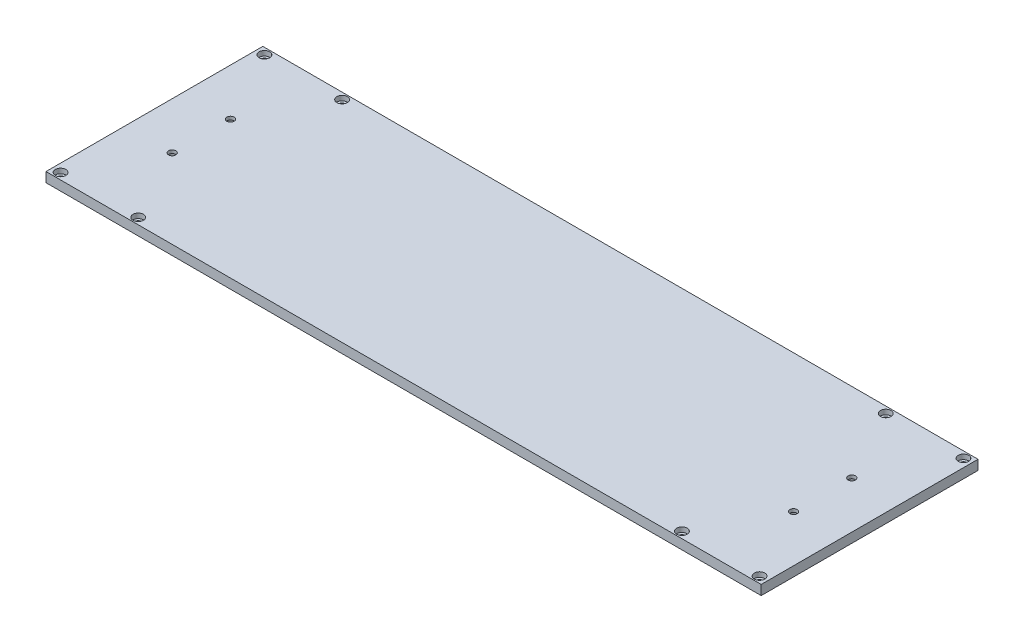
ISO-10303-21;
HEADER;
FILE_DESCRIPTION(('STEP AP214'),'2;1');
FILE_NAME('part.step','',(''),(''),'','','');
FILE_SCHEMA(('AUTOMOTIVE_DESIGN { 1 0 10303 214 1 1 1 1 }'));
ENDSEC;
DATA;
#1=APPLICATION_CONTEXT('core data for automotive mechanical design processes');
#2=APPLICATION_PROTOCOL_DEFINITION('international standard','automotive_design',2000,#1);
#3=PRODUCT_CONTEXT('',#1,'mechanical');
#4=PRODUCT('Part','Part','',(#3));
#5=PRODUCT_RELATED_PRODUCT_CATEGORY('part','',(#4));
#6=PRODUCT_DEFINITION_FORMATION('','',#4);
#7=PRODUCT_DEFINITION_CONTEXT('part definition',#1,'design');
#8=PRODUCT_DEFINITION('design','',#6,#7);
#9=PRODUCT_DEFINITION_SHAPE('','',#8);
#10=(LENGTH_UNIT() NAMED_UNIT(*) SI_UNIT(.MILLI.,.METRE.));
#11=(NAMED_UNIT(*) PLANE_ANGLE_UNIT() SI_UNIT($,.RADIAN.));
#12=(NAMED_UNIT(*) SI_UNIT($,.STERADIAN.) SOLID_ANGLE_UNIT());
#13=UNCERTAINTY_MEASURE_WITH_UNIT(LENGTH_MEASURE(1.E-05),#10,'distance_accuracy_value','');
#14=(GEOMETRIC_REPRESENTATION_CONTEXT(3) GLOBAL_UNCERTAINTY_ASSIGNED_CONTEXT((#13)) GLOBAL_UNIT_ASSIGNED_CONTEXT((#10,
#11,#12)) REPRESENTATION_CONTEXT('',''));
#15=CARTESIAN_POINT('',(0.,0.,0.));
#16=DIRECTION('',(0.,0.,1.));
#17=DIRECTION('',(1.,0.,0.));
#18=AXIS2_PLACEMENT_3D('',#15,#16,#17);
#19=CARTESIAN_POINT('',(221.,6.,-67.));
#20=DIRECTION('',(-1.,0.,0.));
#21=DIRECTION('',(0.,0.,1.));
#22=AXIS2_PLACEMENT_3D('',#19,#20,#21);
#23=PLANE('',#22);
#24=DIRECTION('',(0.,0.,-1.));
#25=VECTOR('',#24,1.);
#26=CARTESIAN_POINT('',(221.,0.,-67.));
#27=LINE('',#26,#25);
#28=CARTESIAN_POINT('',(221.,0.,67.));
#29=VERTEX_POINT('',#28);
#30=CARTESIAN_POINT('',(221.,0.,-67.));
#31=VERTEX_POINT('',#30);
#32=EDGE_CURVE('E103',#29,#31,#27,.T.);
#33=ORIENTED_EDGE('',*,*,#32,.T.);
#34=DIRECTION('',(0.,-1.,0.));
#35=VECTOR('',#34,1.);
#36=CARTESIAN_POINT('',(221.,6.,-67.));
#37=LINE('',#36,#35);
#38=CARTESIAN_POINT('',(221.,6.,-67.));
#39=VERTEX_POINT('',#38);
#40=EDGE_CURVE('E11',#39,#31,#37,.T.);
#41=ORIENTED_EDGE('',*,*,#40,.F.);
#42=DIRECTION('',(0.,0.,-1.));
#43=VECTOR('',#42,1.);
#44=CARTESIAN_POINT('',(221.,6.,-67.));
#45=LINE('',#44,#43);
#46=CARTESIAN_POINT('',(221.,6.,67.));
#47=VERTEX_POINT('',#46);
#48=EDGE_CURVE('E90',#47,#39,#45,.T.);
#49=ORIENTED_EDGE('',*,*,#48,.F.);
#50=DIRECTION('',(0.,-1.,0.));
#51=VECTOR('',#50,1.);
#52=CARTESIAN_POINT('',(221.,6.,67.));
#53=LINE('',#52,#51);
#54=EDGE_CURVE('E99',#47,#29,#53,.T.);
#55=ORIENTED_EDGE('',*,*,#54,.T.);
#56=EDGE_LOOP('',(#33,#41,#49,#55));
#57=FACE_BOUND('',#56,.T.);
#58=ADVANCED_FACE('F37',(#57),#23,.F.);
#59=CARTESIAN_POINT('',(-221.,6.,-67.));
#60=DIRECTION('',(0.,0.,1.));
#61=DIRECTION('',(1.,0.,0.));
#62=AXIS2_PLACEMENT_3D('',#59,#60,#61);
#63=PLANE('',#62);
#64=DIRECTION('',(-1.,0.,0.));
#65=VECTOR('',#64,1.);
#66=CARTESIAN_POINT('',(-221.,0.,-67.));
#67=LINE('',#66,#65);
#68=CARTESIAN_POINT('',(-221.,0.,-67.));
#69=VERTEX_POINT('',#68);
#70=EDGE_CURVE('E94',#31,#69,#67,.T.);
#71=ORIENTED_EDGE('',*,*,#70,.T.);
#72=DIRECTION('',(0.,-1.,0.));
#73=VECTOR('',#72,1.);
#74=CARTESIAN_POINT('',(-221.,6.,-67.));
#75=LINE('',#74,#73);
#76=CARTESIAN_POINT('',(-221.,6.,-67.));
#77=VERTEX_POINT('',#76);
#78=EDGE_CURVE('E46',#77,#69,#75,.T.);
#79=ORIENTED_EDGE('',*,*,#78,.F.);
#80=DIRECTION('',(-1.,0.,0.));
#81=VECTOR('',#80,1.);
#82=CARTESIAN_POINT('',(-221.,6.,-67.));
#83=LINE('',#82,#81);
#84=EDGE_CURVE('E85',#39,#77,#83,.T.);
#85=ORIENTED_EDGE('',*,*,#84,.F.);
#86=ORIENTED_EDGE('',*,*,#40,.T.);
#87=EDGE_LOOP('',(#71,#79,#85,#86));
#88=FACE_BOUND('',#87,.T.);
#89=ADVANCED_FACE('F93',(#88),#63,.F.);
#90=CARTESIAN_POINT('',(-221.,6.,-67.));
#91=DIRECTION('',(1.,0.,0.));
#92=DIRECTION('',(0.,0.,-1.));
#93=AXIS2_PLACEMENT_3D('',#90,#91,#92);
#94=PLANE('',#93);
#95=DIRECTION('',(0.,0.,1.));
#96=VECTOR('',#95,1.);
#97=CARTESIAN_POINT('',(-221.,0.,-67.));
#98=LINE('',#97,#96);
#99=CARTESIAN_POINT('',(-221.,0.,67.));
#100=VERTEX_POINT('',#99);
#101=EDGE_CURVE('E72',#69,#100,#98,.T.);
#102=ORIENTED_EDGE('',*,*,#101,.T.);
#103=DIRECTION('',(0.,-1.,0.));
#104=VECTOR('',#103,1.);
#105=CARTESIAN_POINT('',(-221.,6.,67.));
#106=LINE('',#105,#104);
#107=CARTESIAN_POINT('',(-221.,6.,67.));
#108=VERTEX_POINT('',#107);
#109=EDGE_CURVE('E95',#108,#100,#106,.T.);
#110=ORIENTED_EDGE('',*,*,#109,.F.);
#111=DIRECTION('',(0.,0.,1.));
#112=VECTOR('',#111,1.);
#113=CARTESIAN_POINT('',(-221.,6.,-67.));
#114=LINE('',#113,#112);
#115=EDGE_CURVE('E88',#77,#108,#114,.T.);
#116=ORIENTED_EDGE('',*,*,#115,.F.);
#117=ORIENTED_EDGE('',*,*,#78,.T.);
#118=EDGE_LOOP('',(#102,#110,#116,#117));
#119=FACE_BOUND('',#118,.T.);
#120=ADVANCED_FACE('F97',(#119),#94,.F.);
#121=CARTESIAN_POINT('',(-221.,6.,67.));
#122=DIRECTION('',(0.,0.,-1.));
#123=DIRECTION('',(-1.,0.,0.));
#124=AXIS2_PLACEMENT_3D('',#121,#122,#123);
#125=PLANE('',#124);
#126=DIRECTION('',(1.,0.,0.));
#127=VECTOR('',#126,1.);
#128=CARTESIAN_POINT('',(-221.,0.,67.));
#129=LINE('',#128,#127);
#130=EDGE_CURVE('E78',#100,#29,#129,.T.);
#131=ORIENTED_EDGE('',*,*,#130,.T.);
#132=ORIENTED_EDGE('',*,*,#54,.F.);
#133=DIRECTION('',(1.,0.,0.));
#134=VECTOR('',#133,1.);
#135=CARTESIAN_POINT('',(-221.,6.,67.));
#136=LINE('',#135,#134);
#137=EDGE_CURVE('E55',#108,#47,#136,.T.);
#138=ORIENTED_EDGE('',*,*,#137,.F.);
#139=ORIENTED_EDGE('',*,*,#109,.T.);
#140=EDGE_LOOP('',(#131,#132,#138,#139));
#141=FACE_BOUND('',#140,.T.);
#142=ADVANCED_FACE('F264',(#141),#125,.F.);
#143=CARTESIAN_POINT('',(0.,6.,0.));
#144=DIRECTION('',(0.,1.,0.));
#145=DIRECTION('',(0.,0.,1.));
#146=AXIS2_PLACEMENT_3D('',#143,#144,#145);
#147=PLANE('',#146);
#148=CARTESIAN_POINT('',(-192.,6.,-18.));
#149=DIRECTION('',(0.,1.,0.));
#150=DIRECTION('',(0.,0.,1.));
#151=AXIS2_PLACEMENT_3D('',#148,#149,#150);
#152=CIRCLE('',#151,2.25);
#153=CARTESIAN_POINT('',(-192.,6.,-15.75));
#154=VERTEX_POINT('',#153);
#155=EDGE_CURVE('E40',#154,#154,#152,.T.);
#156=ORIENTED_EDGE('',*,*,#155,.F.);
#157=EDGE_LOOP('',(#156));
#158=FACE_BOUND('',#157,.T.);
#159=CARTESIAN_POINT('',(-192.,6.,18.));
#160=DIRECTION('',(0.,1.,0.));
#161=DIRECTION('',(0.,0.,1.));
#162=AXIS2_PLACEMENT_3D('',#159,#160,#161);
#163=CIRCLE('',#162,2.25);
#164=CARTESIAN_POINT('',(-192.,6.,20.25));
#165=VERTEX_POINT('',#164);
#166=EDGE_CURVE('E139',#165,#165,#163,.T.);
#167=ORIENTED_EDGE('',*,*,#166,.F.);
#168=EDGE_LOOP('',(#167));
#169=FACE_BOUND('',#168,.T.);
#170=CARTESIAN_POINT('',(-216.,6.,-63.));
#171=DIRECTION('',(0.,1.,0.));
#172=DIRECTION('',(0.,0.,1.));
#173=AXIS2_PLACEMENT_3D('',#170,#171,#172);
#174=CIRCLE('',#173,3.25);
#175=CARTESIAN_POINT('',(-216.,6.,-59.75));
#176=VERTEX_POINT('',#175);
#177=EDGE_CURVE('E141',#176,#176,#174,.T.);
#178=ORIENTED_EDGE('',*,*,#177,.F.);
#179=EDGE_LOOP('',(#178));
#180=FACE_BOUND('',#179,.T.);
#181=CARTESIAN_POINT('',(-216.,6.,63.));
#182=DIRECTION('',(0.,1.,0.));
#183=DIRECTION('',(0.,0.,1.));
#184=AXIS2_PLACEMENT_3D('',#181,#182,#183);
#185=CIRCLE('',#184,3.25);
#186=CARTESIAN_POINT('',(-216.,6.,66.25));
#187=VERTEX_POINT('',#186);
#188=EDGE_CURVE('E166',#187,#187,#185,.T.);
#189=ORIENTED_EDGE('',*,*,#188,.F.);
#190=EDGE_LOOP('',(#189));
#191=FACE_BOUND('',#190,.T.);
#192=CARTESIAN_POINT('',(-168.,6.,63.));
#193=DIRECTION('',(0.,1.,0.));
#194=DIRECTION('',(0.,0.,1.));
#195=AXIS2_PLACEMENT_3D('',#192,#193,#194);
#196=CIRCLE('',#195,3.25);
#197=CARTESIAN_POINT('',(-168.,6.,66.25));
#198=VERTEX_POINT('',#197);
#199=EDGE_CURVE('E178',#198,#198,#196,.T.);
#200=ORIENTED_EDGE('',*,*,#199,.F.);
#201=EDGE_LOOP('',(#200));
#202=FACE_BOUND('',#201,.T.);
#203=CARTESIAN_POINT('',(-168.,6.,-63.));
#204=DIRECTION('',(0.,1.,0.));
#205=DIRECTION('',(0.,0.,1.));
#206=AXIS2_PLACEMENT_3D('',#203,#204,#205);
#207=CIRCLE('',#206,3.25);
#208=CARTESIAN_POINT('',(-168.,6.,-59.75));
#209=VERTEX_POINT('',#208);
#210=EDGE_CURVE('E190',#209,#209,#207,.T.);
#211=ORIENTED_EDGE('',*,*,#210,.F.);
#212=EDGE_LOOP('',(#211));
#213=FACE_BOUND('',#212,.T.);
#214=CARTESIAN_POINT('',(192.,6.,-18.));
#215=DIRECTION('',(0.,1.,0.));
#216=DIRECTION('',(0.,0.,1.));
#217=AXIS2_PLACEMENT_3D('',#214,#215,#216);
#218=CIRCLE('',#217,2.25);
#219=CARTESIAN_POINT('',(192.,6.,-15.75));
#220=VERTEX_POINT('',#219);
#221=EDGE_CURVE('E135',#220,#220,#218,.T.);
#222=ORIENTED_EDGE('',*,*,#221,.F.);
#223=EDGE_LOOP('',(#222));
#224=FACE_BOUND('',#223,.T.);
#225=CARTESIAN_POINT('',(192.,6.,18.));
#226=DIRECTION('',(0.,1.,0.));
#227=DIRECTION('',(0.,0.,1.));
#228=AXIS2_PLACEMENT_3D('',#225,#226,#227);
#229=CIRCLE('',#228,2.25);
#230=CARTESIAN_POINT('',(192.,6.,20.25));
#231=VERTEX_POINT('',#230);
#232=EDGE_CURVE('E130',#231,#231,#229,.T.);
#233=ORIENTED_EDGE('',*,*,#232,.F.);
#234=EDGE_LOOP('',(#233));
#235=FACE_BOUND('',#234,.T.);
#236=CARTESIAN_POINT('',(216.,6.,-63.));
#237=DIRECTION('',(0.,1.,0.));
#238=DIRECTION('',(0.,0.,1.));
#239=AXIS2_PLACEMENT_3D('',#236,#237,#238);
#240=CIRCLE('',#239,3.25);
#241=CARTESIAN_POINT('',(216.,6.,-59.75));
#242=VERTEX_POINT('',#241);
#243=EDGE_CURVE('E133',#242,#242,#240,.T.);
#244=ORIENTED_EDGE('',*,*,#243,.F.);
#245=EDGE_LOOP('',(#244));
#246=FACE_BOUND('',#245,.T.);
#247=CARTESIAN_POINT('',(168.,6.,-63.));
#248=DIRECTION('',(0.,1.,0.));
#249=DIRECTION('',(0.,0.,1.));
#250=AXIS2_PLACEMENT_3D('',#247,#248,#249);
#251=CIRCLE('',#250,3.25);
#252=CARTESIAN_POINT('',(168.,6.,-59.75));
#253=VERTEX_POINT('',#252);
#254=EDGE_CURVE('E128',#253,#253,#251,.T.);
#255=ORIENTED_EDGE('',*,*,#254,.F.);
#256=EDGE_LOOP('',(#255));
#257=FACE_BOUND('',#256,.T.);
#258=CARTESIAN_POINT('',(168.,6.,63.));
#259=DIRECTION('',(0.,1.,0.));
#260=DIRECTION('',(0.,0.,1.));
#261=AXIS2_PLACEMENT_3D('',#258,#259,#260);
#262=CIRCLE('',#261,3.25);
#263=CARTESIAN_POINT('',(168.,6.,66.25));
#264=VERTEX_POINT('',#263);
#265=EDGE_CURVE('E123',#264,#264,#262,.T.);
#266=ORIENTED_EDGE('',*,*,#265,.F.);
#267=EDGE_LOOP('',(#266));
#268=FACE_BOUND('',#267,.T.);
#269=CARTESIAN_POINT('',(216.,6.,63.));
#270=DIRECTION('',(0.,1.,0.));
#271=DIRECTION('',(0.,0.,1.));
#272=AXIS2_PLACEMENT_3D('',#269,#270,#271);
#273=CIRCLE('',#272,3.25);
#274=CARTESIAN_POINT('',(216.,6.,66.25));
#275=VERTEX_POINT('',#274);
#276=EDGE_CURVE('E118',#275,#275,#273,.T.);
#277=ORIENTED_EDGE('',*,*,#276,.F.);
#278=EDGE_LOOP('',(#277));
#279=FACE_BOUND('',#278,.T.);
#280=ORIENTED_EDGE('',*,*,#48,.T.);
#281=ORIENTED_EDGE('',*,*,#84,.T.);
#282=ORIENTED_EDGE('',*,*,#115,.T.);
#283=ORIENTED_EDGE('',*,*,#137,.T.);
#284=EDGE_LOOP('',(#280,#281,#282,#283));
#285=FACE_BOUND('',#284,.T.);
#286=ADVANCED_FACE('F86',(#158,#169,#180,#191,#202,#213,#224,#235,#246,#257,#268,#279,#285),
#147,.T.);
#287=CARTESIAN_POINT('',(0.,0.,0.));
#288=DIRECTION('',(0.,1.,0.));
#289=DIRECTION('',(0.,0.,1.));
#290=AXIS2_PLACEMENT_3D('',#287,#288,#289);
#291=PLANE('',#290);
#292=CARTESIAN_POINT('',(-192.,0.,-18.));
#293=DIRECTION('',(0.,-1.,0.));
#294=DIRECTION('',(0.,0.,-1.));
#295=AXIS2_PLACEMENT_3D('',#292,#293,#294);
#296=CIRCLE('',#295,4.);
#297=CARTESIAN_POINT('',(-192.,0.,-22.));
#298=VERTEX_POINT('',#297);
#299=EDGE_CURVE('E755',#298,#298,#296,.T.);
#300=ORIENTED_EDGE('',*,*,#299,.F.);
#301=EDGE_LOOP('',(#300));
#302=FACE_BOUND('',#301,.T.);
#303=CARTESIAN_POINT('',(-192.,0.,18.));
#304=DIRECTION('',(0.,-1.,0.));
#305=DIRECTION('',(0.,0.,-1.));
#306=AXIS2_PLACEMENT_3D('',#303,#304,#305);
#307=CIRCLE('',#306,4.);
#308=CARTESIAN_POINT('',(-192.,0.,14.));
#309=VERTEX_POINT('',#308);
#310=EDGE_CURVE('E154',#309,#309,#307,.T.);
#311=ORIENTED_EDGE('',*,*,#310,.F.);
#312=EDGE_LOOP('',(#311));
#313=FACE_BOUND('',#312,.T.);
#314=CARTESIAN_POINT('',(-216.,0.,-63.));
#315=DIRECTION('',(0.,1.,0.));
#316=DIRECTION('',(0.,0.,1.));
#317=AXIS2_PLACEMENT_3D('',#314,#315,#316);
#318=CIRCLE('',#317,1.70000000000001);
#319=CARTESIAN_POINT('',(-216.,0.,-61.3));
#320=VERTEX_POINT('',#319);
#321=EDGE_CURVE('E146',#320,#320,#318,.T.);
#322=ORIENTED_EDGE('',*,*,#321,.T.);
#323=EDGE_LOOP('',(#322));
#324=FACE_BOUND('',#323,.T.);
#325=CARTESIAN_POINT('',(-216.,0.,63.));
#326=DIRECTION('',(0.,1.,0.));
#327=DIRECTION('',(0.,0.,1.));
#328=AXIS2_PLACEMENT_3D('',#325,#326,#327);
#329=CIRCLE('',#328,1.70000000000001);
#330=CARTESIAN_POINT('',(-216.,0.,64.7));
#331=VERTEX_POINT('',#330);
#332=EDGE_CURVE('E169',#331,#331,#329,.T.);
#333=ORIENTED_EDGE('',*,*,#332,.T.);
#334=EDGE_LOOP('',(#333));
#335=FACE_BOUND('',#334,.T.);
#336=CARTESIAN_POINT('',(-168.,0.,63.));
#337=DIRECTION('',(0.,1.,0.));
#338=DIRECTION('',(0.,0.,1.));
#339=AXIS2_PLACEMENT_3D('',#336,#337,#338);
#340=CIRCLE('',#339,1.70000000000001);
#341=CARTESIAN_POINT('',(-168.,0.,64.7));
#342=VERTEX_POINT('',#341);
#343=EDGE_CURVE('E181',#342,#342,#340,.T.);
#344=ORIENTED_EDGE('',*,*,#343,.T.);
#345=EDGE_LOOP('',(#344));
#346=FACE_BOUND('',#345,.T.);
#347=CARTESIAN_POINT('',(-168.,0.,-63.));
#348=DIRECTION('',(0.,1.,0.));
#349=DIRECTION('',(0.,0.,1.));
#350=AXIS2_PLACEMENT_3D('',#347,#348,#349);
#351=CIRCLE('',#350,1.70000000000001);
#352=CARTESIAN_POINT('',(-168.,0.,-61.3));
#353=VERTEX_POINT('',#352);
#354=EDGE_CURVE('E193',#353,#353,#351,.T.);
#355=ORIENTED_EDGE('',*,*,#354,.T.);
#356=EDGE_LOOP('',(#355));
#357=FACE_BOUND('',#356,.T.);
#358=CARTESIAN_POINT('',(192.,0.,-18.));
#359=DIRECTION('',(0.,-1.,0.));
#360=DIRECTION('',(0.,0.,-1.));
#361=AXIS2_PLACEMENT_3D('',#358,#359,#360);
#362=CIRCLE('',#361,4.);
#363=CARTESIAN_POINT('',(192.,0.,-22.));
#364=VERTEX_POINT('',#363);
#365=EDGE_CURVE('E202',#364,#364,#362,.T.);
#366=ORIENTED_EDGE('',*,*,#365,.F.);
#367=EDGE_LOOP('',(#366));
#368=FACE_BOUND('',#367,.T.);
#369=CARTESIAN_POINT('',(192.,0.,18.));
#370=DIRECTION('',(0.,-1.,0.));
#371=DIRECTION('',(0.,0.,-1.));
#372=AXIS2_PLACEMENT_3D('',#369,#370,#371);
#373=CIRCLE('',#372,4.);
#374=CARTESIAN_POINT('',(192.,0.,14.));
#375=VERTEX_POINT('',#374);
#376=EDGE_CURVE('E137',#375,#375,#373,.T.);
#377=ORIENTED_EDGE('',*,*,#376,.F.);
#378=EDGE_LOOP('',(#377));
#379=FACE_BOUND('',#378,.T.);
#380=CARTESIAN_POINT('',(216.,0.,-63.));
#381=DIRECTION('',(0.,1.,0.));
#382=DIRECTION('',(0.,0.,1.));
#383=AXIS2_PLACEMENT_3D('',#380,#381,#382);
#384=CIRCLE('',#383,1.70000000000001);
#385=CARTESIAN_POINT('',(216.,0.,-61.3));
#386=VERTEX_POINT('',#385);
#387=EDGE_CURVE('E125',#386,#386,#384,.T.);
#388=ORIENTED_EDGE('',*,*,#387,.T.);
#389=EDGE_LOOP('',(#388));
#390=FACE_BOUND('',#389,.T.);
#391=CARTESIAN_POINT('',(168.,0.,-63.));
#392=DIRECTION('',(0.,1.,0.));
#393=DIRECTION('',(0.,0.,1.));
#394=AXIS2_PLACEMENT_3D('',#391,#392,#393);
#395=CIRCLE('',#394,1.70000000000001);
#396=CARTESIAN_POINT('',(168.,0.,-61.3));
#397=VERTEX_POINT('',#396);
#398=EDGE_CURVE('E120',#397,#397,#395,.T.);
#399=ORIENTED_EDGE('',*,*,#398,.T.);
#400=EDGE_LOOP('',(#399));
#401=FACE_BOUND('',#400,.T.);
#402=CARTESIAN_POINT('',(168.,0.,63.));
#403=DIRECTION('',(0.,1.,0.));
#404=DIRECTION('',(0.,0.,1.));
#405=AXIS2_PLACEMENT_3D('',#402,#403,#404);
#406=CIRCLE('',#405,1.70000000000001);
#407=CARTESIAN_POINT('',(168.,0.,64.7));
#408=VERTEX_POINT('',#407);
#409=EDGE_CURVE('E115',#408,#408,#406,.T.);
#410=ORIENTED_EDGE('',*,*,#409,.T.);
#411=EDGE_LOOP('',(#410));
#412=FACE_BOUND('',#411,.T.);
#413=CARTESIAN_POINT('',(216.,0.,63.));
#414=DIRECTION('',(0.,1.,0.));
#415=DIRECTION('',(0.,0.,1.));
#416=AXIS2_PLACEMENT_3D('',#413,#414,#415);
#417=CIRCLE('',#416,1.70000000000001);
#418=CARTESIAN_POINT('',(216.,0.,64.7));
#419=VERTEX_POINT('',#418);
#420=EDGE_CURVE('E106',#419,#419,#417,.T.);
#421=ORIENTED_EDGE('',*,*,#420,.T.);
#422=EDGE_LOOP('',(#421));
#423=FACE_BOUND('',#422,.T.);
#424=ORIENTED_EDGE('',*,*,#32,.F.);
#425=ORIENTED_EDGE('',*,*,#130,.F.);
#426=ORIENTED_EDGE('',*,*,#101,.F.);
#427=ORIENTED_EDGE('',*,*,#70,.F.);
#428=EDGE_LOOP('',(#424,#425,#426,#427));
#429=FACE_BOUND('',#428,.T.);
#430=ADVANCED_FACE('F263',(#302,#313,#324,#335,#346,#357,#368,#379,#390,#401,#412,#423,#429),
#291,.F.);
#431=CARTESIAN_POINT('',(216.,6.,63.));
#432=DIRECTION('',(0.,1.,0.));
#433=DIRECTION('',(0.,0.,1.));
#434=AXIS2_PLACEMENT_3D('',#431,#432,#433);
#435=CYLINDRICAL_SURFACE('',#434,1.70000000000001);
#436=CARTESIAN_POINT('',(216.,3.,63.));
#437=DIRECTION('',(0.,1.,0.));
#438=DIRECTION('',(0.,0.,1.));
#439=AXIS2_PLACEMENT_3D('',#436,#437,#438);
#440=CIRCLE('',#439,1.70000000000001);
#441=CARTESIAN_POINT('',(216.,3.,64.7));
#442=VERTEX_POINT('',#441);
#443=EDGE_CURVE('E114',#442,#442,#440,.T.);
#444=ORIENTED_EDGE('',*,*,#443,.T.);
#445=EDGE_LOOP('',(#444));
#446=FACE_BOUND('',#445,.T.);
#447=ORIENTED_EDGE('',*,*,#420,.F.);
#448=EDGE_LOOP('',(#447));
#449=FACE_BOUND('',#448,.T.);
#450=ADVANCED_FACE('F246',(#446,#449),#435,.F.);
#451=CARTESIAN_POINT('',(217.7,3.,63.));
#452=DIRECTION('',(0.,-1.,0.));
#453=DIRECTION('',(0.,0.,-1.));
#454=AXIS2_PLACEMENT_3D('',#451,#452,#453);
#455=PLANE('',#454);
#456=ORIENTED_EDGE('',*,*,#443,.F.);
#457=EDGE_LOOP('',(#456));
#458=FACE_BOUND('',#457,.T.);
#459=CARTESIAN_POINT('',(216.,3.,63.));
#460=DIRECTION('',(0.,1.,0.));
#461=DIRECTION('',(0.,0.,1.));
#462=AXIS2_PLACEMENT_3D('',#459,#460,#461);
#463=CIRCLE('',#462,3.25);
#464=CARTESIAN_POINT('',(216.,3.,66.25));
#465=VERTEX_POINT('',#464);
#466=EDGE_CURVE('E240',#465,#465,#463,.T.);
#467=ORIENTED_EDGE('',*,*,#466,.T.);
#468=EDGE_LOOP('',(#467));
#469=FACE_BOUND('',#468,.T.);
#470=ADVANCED_FACE('F249',(#458,#469),#455,.F.);
#471=CARTESIAN_POINT('',(216.,6.,63.));
#472=DIRECTION('',(0.,1.,0.));
#473=DIRECTION('',(0.,0.,1.));
#474=AXIS2_PLACEMENT_3D('',#471,#472,#473);
#475=CYLINDRICAL_SURFACE('',#474,3.25);
#476=ORIENTED_EDGE('',*,*,#466,.F.);
#477=EDGE_LOOP('',(#476));
#478=FACE_BOUND('',#477,.T.);
#479=ORIENTED_EDGE('',*,*,#276,.T.);
#480=EDGE_LOOP('',(#479));
#481=FACE_BOUND('',#480,.T.);
#482=ADVANCED_FACE('F252',(#478,#481),#475,.F.);
#483=CARTESIAN_POINT('',(168.,6.,63.));
#484=DIRECTION('',(0.,1.,0.));
#485=DIRECTION('',(0.,0.,1.));
#486=AXIS2_PLACEMENT_3D('',#483,#484,#485);
#487=CYLINDRICAL_SURFACE('',#486,1.70000000000001);
#488=CARTESIAN_POINT('',(168.,3.,63.));
#489=DIRECTION('',(0.,1.,0.));
#490=DIRECTION('',(0.,0.,1.));
#491=AXIS2_PLACEMENT_3D('',#488,#489,#490);
#492=CIRCLE('',#491,1.70000000000001);
#493=CARTESIAN_POINT('',(168.,3.,64.7));
#494=VERTEX_POINT('',#493);
#495=EDGE_CURVE('E119',#494,#494,#492,.T.);
#496=ORIENTED_EDGE('',*,*,#495,.T.);
#497=EDGE_LOOP('',(#496));
#498=FACE_BOUND('',#497,.T.);
#499=ORIENTED_EDGE('',*,*,#409,.F.);
#500=EDGE_LOOP('',(#499));
#501=FACE_BOUND('',#500,.T.);
#502=ADVANCED_FACE('F258',(#498,#501),#487,.F.);
#503=CARTESIAN_POINT('',(169.7,3.,63.));
#504=DIRECTION('',(0.,-1.,0.));
#505=DIRECTION('',(0.,0.,-1.));
#506=AXIS2_PLACEMENT_3D('',#503,#504,#505);
#507=PLANE('',#506);
#508=ORIENTED_EDGE('',*,*,#495,.F.);
#509=EDGE_LOOP('',(#508));
#510=FACE_BOUND('',#509,.T.);
#511=CARTESIAN_POINT('',(168.,3.,63.));
#512=DIRECTION('',(0.,1.,0.));
#513=DIRECTION('',(0.,0.,1.));
#514=AXIS2_PLACEMENT_3D('',#511,#512,#513);
#515=CIRCLE('',#514,3.25);
#516=CARTESIAN_POINT('',(168.,3.,66.25));
#517=VERTEX_POINT('',#516);
#518=EDGE_CURVE('E233',#517,#517,#515,.T.);
#519=ORIENTED_EDGE('',*,*,#518,.T.);
#520=EDGE_LOOP('',(#519));
#521=FACE_BOUND('',#520,.T.);
#522=ADVANCED_FACE('F328',(#510,#521),#507,.F.);
#523=CARTESIAN_POINT('',(168.,6.,63.));
#524=DIRECTION('',(0.,1.,0.));
#525=DIRECTION('',(0.,0.,1.));
#526=AXIS2_PLACEMENT_3D('',#523,#524,#525);
#527=CYLINDRICAL_SURFACE('',#526,3.25);
#528=ORIENTED_EDGE('',*,*,#518,.F.);
#529=EDGE_LOOP('',(#528));
#530=FACE_BOUND('',#529,.T.);
#531=ORIENTED_EDGE('',*,*,#265,.T.);
#532=EDGE_LOOP('',(#531));
#533=FACE_BOUND('',#532,.T.);
#534=ADVANCED_FACE('F339',(#530,#533),#527,.F.);
#535=CARTESIAN_POINT('',(168.,6.,-63.));
#536=DIRECTION('',(0.,1.,0.));
#537=DIRECTION('',(0.,0.,1.));
#538=AXIS2_PLACEMENT_3D('',#535,#536,#537);
#539=CYLINDRICAL_SURFACE('',#538,1.70000000000001);
#540=CARTESIAN_POINT('',(168.,3.,-63.));
#541=DIRECTION('',(0.,1.,0.));
#542=DIRECTION('',(0.,0.,1.));
#543=AXIS2_PLACEMENT_3D('',#540,#541,#542);
#544=CIRCLE('',#543,1.70000000000001);
#545=CARTESIAN_POINT('',(168.,3.,-61.3));
#546=VERTEX_POINT('',#545);
#547=EDGE_CURVE('E124',#546,#546,#544,.T.);
#548=ORIENTED_EDGE('',*,*,#547,.T.);
#549=EDGE_LOOP('',(#548));
#550=FACE_BOUND('',#549,.T.);
#551=ORIENTED_EDGE('',*,*,#398,.F.);
#552=EDGE_LOOP('',(#551));
#553=FACE_BOUND('',#552,.T.);
#554=ADVANCED_FACE('F350',(#550,#553),#539,.F.);
#555=CARTESIAN_POINT('',(169.7,3.,-63.));
#556=DIRECTION('',(0.,-1.,0.));
#557=DIRECTION('',(0.,0.,-1.));
#558=AXIS2_PLACEMENT_3D('',#555,#556,#557);
#559=PLANE('',#558);
#560=ORIENTED_EDGE('',*,*,#547,.F.);
#561=EDGE_LOOP('',(#560));
#562=FACE_BOUND('',#561,.T.);
#563=CARTESIAN_POINT('',(168.,3.,-63.));
#564=DIRECTION('',(0.,1.,0.));
#565=DIRECTION('',(0.,0.,1.));
#566=AXIS2_PLACEMENT_3D('',#563,#564,#565);
#567=CIRCLE('',#566,3.25);
#568=CARTESIAN_POINT('',(168.,3.,-59.75));
#569=VERTEX_POINT('',#568);
#570=EDGE_CURVE('E226',#569,#569,#567,.T.);
#571=ORIENTED_EDGE('',*,*,#570,.T.);
#572=EDGE_LOOP('',(#571));
#573=FACE_BOUND('',#572,.T.);
#574=ADVANCED_FACE('F361',(#562,#573),#559,.F.);
#575=CARTESIAN_POINT('',(168.,6.,-63.));
#576=DIRECTION('',(0.,1.,0.));
#577=DIRECTION('',(0.,0.,1.));
#578=AXIS2_PLACEMENT_3D('',#575,#576,#577);
#579=CYLINDRICAL_SURFACE('',#578,3.25);
#580=ORIENTED_EDGE('',*,*,#570,.F.);
#581=EDGE_LOOP('',(#580));
#582=FACE_BOUND('',#581,.T.);
#583=ORIENTED_EDGE('',*,*,#254,.T.);
#584=EDGE_LOOP('',(#583));
#585=FACE_BOUND('',#584,.T.);
#586=ADVANCED_FACE('F372',(#582,#585),#579,.F.);
#587=CARTESIAN_POINT('',(216.,6.,-63.));
#588=DIRECTION('',(0.,1.,0.));
#589=DIRECTION('',(0.,0.,1.));
#590=AXIS2_PLACEMENT_3D('',#587,#588,#589);
#591=CYLINDRICAL_SURFACE('',#590,1.70000000000001);
#592=CARTESIAN_POINT('',(216.,3.,-63.));
#593=DIRECTION('',(0.,1.,0.));
#594=DIRECTION('',(0.,0.,1.));
#595=AXIS2_PLACEMENT_3D('',#592,#593,#594);
#596=CIRCLE('',#595,1.70000000000001);
#597=CARTESIAN_POINT('',(216.,3.,-61.3));
#598=VERTEX_POINT('',#597);
#599=EDGE_CURVE('E129',#598,#598,#596,.T.);
#600=ORIENTED_EDGE('',*,*,#599,.T.);
#601=EDGE_LOOP('',(#600));
#602=FACE_BOUND('',#601,.T.);
#603=ORIENTED_EDGE('',*,*,#387,.F.);
#604=EDGE_LOOP('',(#603));
#605=FACE_BOUND('',#604,.T.);
#606=ADVANCED_FACE('F383',(#602,#605),#591,.F.);
#607=CARTESIAN_POINT('',(217.7,3.,-63.));
#608=DIRECTION('',(0.,-1.,0.));
#609=DIRECTION('',(0.,0.,-1.));
#610=AXIS2_PLACEMENT_3D('',#607,#608,#609);
#611=PLANE('',#610);
#612=ORIENTED_EDGE('',*,*,#599,.F.);
#613=EDGE_LOOP('',(#612));
#614=FACE_BOUND('',#613,.T.);
#615=CARTESIAN_POINT('',(216.,3.,-63.));
#616=DIRECTION('',(0.,1.,0.));
#617=DIRECTION('',(0.,0.,1.));
#618=AXIS2_PLACEMENT_3D('',#615,#616,#617);
#619=CIRCLE('',#618,3.25);
#620=CARTESIAN_POINT('',(216.,3.,-59.75));
#621=VERTEX_POINT('',#620);
#622=EDGE_CURVE('E219',#621,#621,#619,.T.);
#623=ORIENTED_EDGE('',*,*,#622,.T.);
#624=EDGE_LOOP('',(#623));
#625=FACE_BOUND('',#624,.T.);
#626=ADVANCED_FACE('F394',(#614,#625),#611,.F.);
#627=CARTESIAN_POINT('',(216.,6.,-63.));
#628=DIRECTION('',(0.,1.,0.));
#629=DIRECTION('',(0.,0.,1.));
#630=AXIS2_PLACEMENT_3D('',#627,#628,#629);
#631=CYLINDRICAL_SURFACE('',#630,3.25);
#632=ORIENTED_EDGE('',*,*,#622,.F.);
#633=EDGE_LOOP('',(#632));
#634=FACE_BOUND('',#633,.T.);
#635=ORIENTED_EDGE('',*,*,#243,.T.);
#636=EDGE_LOOP('',(#635));
#637=FACE_BOUND('',#636,.T.);
#638=ADVANCED_FACE('F405',(#634,#637),#631,.F.);
#639=CARTESIAN_POINT('',(192.,0.,18.));
#640=DIRECTION('',(0.,-1.,0.));
#641=DIRECTION('',(0.,0.,-1.));
#642=AXIS2_PLACEMENT_3D('',#639,#640,#641);
#643=CYLINDRICAL_SURFACE('',#642,2.25);
#644=ORIENTED_EDGE('',*,*,#232,.T.);
#645=EDGE_LOOP('',(#644));
#646=FACE_BOUND('',#645,.T.);
#647=CARTESIAN_POINT('',(192.,4.,18.));
#648=DIRECTION('',(0.,-1.,0.));
#649=DIRECTION('',(0.,0.,-1.));
#650=AXIS2_PLACEMENT_3D('',#647,#648,#649);
#651=CIRCLE('',#650,2.25);
#652=CARTESIAN_POINT('',(192.,4.,15.75));
#653=VERTEX_POINT('',#652);
#654=EDGE_CURVE('E134',#653,#653,#651,.T.);
#655=ORIENTED_EDGE('',*,*,#654,.T.);
#656=EDGE_LOOP('',(#655));
#657=FACE_BOUND('',#656,.T.);
#658=ADVANCED_FACE('F416',(#646,#657),#643,.F.);
#659=CARTESIAN_POINT('',(194.25,4.,18.));
#660=DIRECTION('',(0.,1.,0.));
#661=DIRECTION('',(0.,0.,1.));
#662=AXIS2_PLACEMENT_3D('',#659,#660,#661);
#663=PLANE('',#662);
#664=ORIENTED_EDGE('',*,*,#654,.F.);
#665=EDGE_LOOP('',(#664));
#666=FACE_BOUND('',#665,.T.);
#667=CARTESIAN_POINT('',(192.,4.,18.));
#668=DIRECTION('',(0.,-1.,0.));
#669=DIRECTION('',(0.,0.,-1.));
#670=AXIS2_PLACEMENT_3D('',#667,#668,#669);
#671=CIRCLE('',#670,4.);
#672=CARTESIAN_POINT('',(192.,4.,14.));
#673=VERTEX_POINT('',#672);
#674=EDGE_CURVE('E212',#673,#673,#671,.T.);
#675=ORIENTED_EDGE('',*,*,#674,.T.);
#676=EDGE_LOOP('',(#675));
#677=FACE_BOUND('',#676,.T.);
#678=ADVANCED_FACE('F427',(#666,#677),#663,.F.);
#679=CARTESIAN_POINT('',(192.,0.,18.));
#680=DIRECTION('',(0.,-1.,0.));
#681=DIRECTION('',(0.,0.,-1.));
#682=AXIS2_PLACEMENT_3D('',#679,#680,#681);
#683=CYLINDRICAL_SURFACE('',#682,4.);
#684=ORIENTED_EDGE('',*,*,#674,.F.);
#685=EDGE_LOOP('',(#684));
#686=FACE_BOUND('',#685,.T.);
#687=ORIENTED_EDGE('',*,*,#376,.T.);
#688=EDGE_LOOP('',(#687));
#689=FACE_BOUND('',#688,.T.);
#690=ADVANCED_FACE('F438',(#686,#689),#683,.F.);
#691=CARTESIAN_POINT('',(192.,0.,-18.));
#692=DIRECTION('',(0.,-1.,0.));
#693=DIRECTION('',(0.,0.,-1.));
#694=AXIS2_PLACEMENT_3D('',#691,#692,#693);
#695=CYLINDRICAL_SURFACE('',#694,2.25);
#696=ORIENTED_EDGE('',*,*,#221,.T.);
#697=EDGE_LOOP('',(#696));
#698=FACE_BOUND('',#697,.T.);
#699=CARTESIAN_POINT('',(192.,4.,-18.));
#700=DIRECTION('',(0.,-1.,0.));
#701=DIRECTION('',(0.,0.,-1.));
#702=AXIS2_PLACEMENT_3D('',#699,#700,#701);
#703=CIRCLE('',#702,2.25);
#704=CARTESIAN_POINT('',(192.,4.,-20.25));
#705=VERTEX_POINT('',#704);
#706=EDGE_CURVE('E138',#705,#705,#703,.T.);
#707=ORIENTED_EDGE('',*,*,#706,.T.);
#708=EDGE_LOOP('',(#707));
#709=FACE_BOUND('',#708,.T.);
#710=ADVANCED_FACE('F449',(#698,#709),#695,.F.);
#711=CARTESIAN_POINT('',(194.25,4.,-18.));
#712=DIRECTION('',(0.,1.,0.));
#713=DIRECTION('',(0.,0.,1.));
#714=AXIS2_PLACEMENT_3D('',#711,#712,#713);
#715=PLANE('',#714);
#716=ORIENTED_EDGE('',*,*,#706,.F.);
#717=EDGE_LOOP('',(#716));
#718=FACE_BOUND('',#717,.T.);
#719=CARTESIAN_POINT('',(192.,4.,-18.));
#720=DIRECTION('',(0.,-1.,0.));
#721=DIRECTION('',(0.,0.,-1.));
#722=AXIS2_PLACEMENT_3D('',#719,#720,#721);
#723=CIRCLE('',#722,4.);
#724=CARTESIAN_POINT('',(192.,4.,-22.));
#725=VERTEX_POINT('',#724);
#726=EDGE_CURVE('E205',#725,#725,#723,.T.);
#727=ORIENTED_EDGE('',*,*,#726,.T.);
#728=EDGE_LOOP('',(#727));
#729=FACE_BOUND('',#728,.T.);
#730=ADVANCED_FACE('F460',(#718,#729),#715,.F.);
#731=CARTESIAN_POINT('',(192.,0.,-18.));
#732=DIRECTION('',(0.,-1.,0.));
#733=DIRECTION('',(0.,0.,-1.));
#734=AXIS2_PLACEMENT_3D('',#731,#732,#733);
#735=CYLINDRICAL_SURFACE('',#734,4.);
#736=ORIENTED_EDGE('',*,*,#726,.F.);
#737=EDGE_LOOP('',(#736));
#738=FACE_BOUND('',#737,.T.);
#739=ORIENTED_EDGE('',*,*,#365,.T.);
#740=EDGE_LOOP('',(#739));
#741=FACE_BOUND('',#740,.T.);
#742=ADVANCED_FACE('F471',(#738,#741),#735,.F.);
#743=CARTESIAN_POINT('',(-168.,6.,-63.));
#744=DIRECTION('',(0.,1.,0.));
#745=DIRECTION('',(0.,0.,1.));
#746=AXIS2_PLACEMENT_3D('',#743,#744,#745);
#747=CYLINDRICAL_SURFACE('',#746,1.70000000000001);
#748=CARTESIAN_POINT('',(-168.,3.,-63.));
#749=DIRECTION('',(0.,1.,0.));
#750=DIRECTION('',(0.,0.,1.));
#751=AXIS2_PLACEMENT_3D('',#748,#749,#750);
#752=CIRCLE('',#751,1.70000000000001);
#753=CARTESIAN_POINT('',(-168.,3.,-61.3));
#754=VERTEX_POINT('',#753);
#755=EDGE_CURVE('E199',#754,#754,#752,.T.);
#756=ORIENTED_EDGE('',*,*,#755,.T.);
#757=EDGE_LOOP('',(#756));
#758=FACE_BOUND('',#757,.T.);
#759=ORIENTED_EDGE('',*,*,#354,.F.);
#760=EDGE_LOOP('',(#759));
#761=FACE_BOUND('',#760,.T.);
#762=ADVANCED_FACE('F481',(#758,#761),#747,.F.);
#763=CARTESIAN_POINT('',(-166.3,3.,-63.));
#764=DIRECTION('',(0.,-1.,0.));
#765=DIRECTION('',(0.,0.,-1.));
#766=AXIS2_PLACEMENT_3D('',#763,#764,#765);
#767=PLANE('',#766);
#768=ORIENTED_EDGE('',*,*,#755,.F.);
#769=EDGE_LOOP('',(#768));
#770=FACE_BOUND('',#769,.T.);
#771=CARTESIAN_POINT('',(-168.,3.,-63.));
#772=DIRECTION('',(0.,1.,0.));
#773=DIRECTION('',(0.,0.,1.));
#774=AXIS2_PLACEMENT_3D('',#771,#772,#773);
#775=CIRCLE('',#774,3.25);
#776=CARTESIAN_POINT('',(-168.,3.,-59.75));
#777=VERTEX_POINT('',#776);
#778=EDGE_CURVE('E196',#777,#777,#775,.T.);
#779=ORIENTED_EDGE('',*,*,#778,.T.);
#780=EDGE_LOOP('',(#779));
#781=FACE_BOUND('',#780,.T.);
#782=ADVANCED_FACE('F503',(#770,#781),#767,.F.);
#783=CARTESIAN_POINT('',(-168.,6.,-63.));
#784=DIRECTION('',(0.,1.,0.));
#785=DIRECTION('',(0.,0.,1.));
#786=AXIS2_PLACEMENT_3D('',#783,#784,#785);
#787=CYLINDRICAL_SURFACE('',#786,3.25);
#788=ORIENTED_EDGE('',*,*,#778,.F.);
#789=EDGE_LOOP('',(#788));
#790=FACE_BOUND('',#789,.T.);
#791=ORIENTED_EDGE('',*,*,#210,.T.);
#792=EDGE_LOOP('',(#791));
#793=FACE_BOUND('',#792,.T.);
#794=ADVANCED_FACE('F514',(#790,#793),#787,.F.);
#795=CARTESIAN_POINT('',(-168.,6.,63.));
#796=DIRECTION('',(0.,1.,0.));
#797=DIRECTION('',(0.,0.,1.));
#798=AXIS2_PLACEMENT_3D('',#795,#796,#797);
#799=CYLINDRICAL_SURFACE('',#798,1.70000000000001);
#800=CARTESIAN_POINT('',(-168.,3.,63.));
#801=DIRECTION('',(0.,1.,0.));
#802=DIRECTION('',(0.,0.,1.));
#803=AXIS2_PLACEMENT_3D('',#800,#801,#802);
#804=CIRCLE('',#803,1.70000000000001);
#805=CARTESIAN_POINT('',(-168.,3.,64.7));
#806=VERTEX_POINT('',#805);
#807=EDGE_CURVE('E187',#806,#806,#804,.T.);
#808=ORIENTED_EDGE('',*,*,#807,.T.);
#809=EDGE_LOOP('',(#808));
#810=FACE_BOUND('',#809,.T.);
#811=ORIENTED_EDGE('',*,*,#343,.F.);
#812=EDGE_LOOP('',(#811));
#813=FACE_BOUND('',#812,.T.);
#814=ADVANCED_FACE('F525',(#810,#813),#799,.F.);
#815=CARTESIAN_POINT('',(-166.3,3.,63.));
#816=DIRECTION('',(0.,-1.,0.));
#817=DIRECTION('',(0.,0.,-1.));
#818=AXIS2_PLACEMENT_3D('',#815,#816,#817);
#819=PLANE('',#818);
#820=ORIENTED_EDGE('',*,*,#807,.F.);
#821=EDGE_LOOP('',(#820));
#822=FACE_BOUND('',#821,.T.);
#823=CARTESIAN_POINT('',(-168.,3.,63.));
#824=DIRECTION('',(0.,1.,0.));
#825=DIRECTION('',(0.,0.,1.));
#826=AXIS2_PLACEMENT_3D('',#823,#824,#825);
#827=CIRCLE('',#826,3.25);
#828=CARTESIAN_POINT('',(-168.,3.,66.25));
#829=VERTEX_POINT('',#828);
#830=EDGE_CURVE('E184',#829,#829,#827,.T.);
#831=ORIENTED_EDGE('',*,*,#830,.T.);
#832=EDGE_LOOP('',(#831));
#833=FACE_BOUND('',#832,.T.);
#834=ADVANCED_FACE('F536',(#822,#833),#819,.F.);
#835=CARTESIAN_POINT('',(-168.,6.,63.));
#836=DIRECTION('',(0.,1.,0.));
#837=DIRECTION('',(0.,0.,1.));
#838=AXIS2_PLACEMENT_3D('',#835,#836,#837);
#839=CYLINDRICAL_SURFACE('',#838,3.25);
#840=ORIENTED_EDGE('',*,*,#830,.F.);
#841=EDGE_LOOP('',(#840));
#842=FACE_BOUND('',#841,.T.);
#843=ORIENTED_EDGE('',*,*,#199,.T.);
#844=EDGE_LOOP('',(#843));
#845=FACE_BOUND('',#844,.T.);
#846=ADVANCED_FACE('F547',(#842,#845),#839,.F.);
#847=CARTESIAN_POINT('',(-216.,6.,63.));
#848=DIRECTION('',(0.,1.,0.));
#849=DIRECTION('',(0.,0.,1.));
#850=AXIS2_PLACEMENT_3D('',#847,#848,#849);
#851=CYLINDRICAL_SURFACE('',#850,1.70000000000001);
#852=CARTESIAN_POINT('',(-216.,3.,63.));
#853=DIRECTION('',(0.,1.,0.));
#854=DIRECTION('',(0.,0.,1.));
#855=AXIS2_PLACEMENT_3D('',#852,#853,#854);
#856=CIRCLE('',#855,1.70000000000001);
#857=CARTESIAN_POINT('',(-216.,3.,64.7));
#858=VERTEX_POINT('',#857);
#859=EDGE_CURVE('E175',#858,#858,#856,.T.);
#860=ORIENTED_EDGE('',*,*,#859,.T.);
#861=EDGE_LOOP('',(#860));
#862=FACE_BOUND('',#861,.T.);
#863=ORIENTED_EDGE('',*,*,#332,.F.);
#864=EDGE_LOOP('',(#863));
#865=FACE_BOUND('',#864,.T.);
#866=ADVANCED_FACE('F558',(#862,#865),#851,.F.);
#867=CARTESIAN_POINT('',(-214.3,3.,63.));
#868=DIRECTION('',(0.,-1.,0.));
#869=DIRECTION('',(0.,0.,-1.));
#870=AXIS2_PLACEMENT_3D('',#867,#868,#869);
#871=PLANE('',#870);
#872=ORIENTED_EDGE('',*,*,#859,.F.);
#873=EDGE_LOOP('',(#872));
#874=FACE_BOUND('',#873,.T.);
#875=CARTESIAN_POINT('',(-216.,3.,63.));
#876=DIRECTION('',(0.,1.,0.));
#877=DIRECTION('',(0.,0.,1.));
#878=AXIS2_PLACEMENT_3D('',#875,#876,#877);
#879=CIRCLE('',#878,3.25);
#880=CARTESIAN_POINT('',(-216.,3.,66.25));
#881=VERTEX_POINT('',#880);
#882=EDGE_CURVE('E172',#881,#881,#879,.T.);
#883=ORIENTED_EDGE('',*,*,#882,.T.);
#884=EDGE_LOOP('',(#883));
#885=FACE_BOUND('',#884,.T.);
#886=ADVANCED_FACE('F569',(#874,#885),#871,.F.);
#887=CARTESIAN_POINT('',(-216.,6.,63.));
#888=DIRECTION('',(0.,1.,0.));
#889=DIRECTION('',(0.,0.,1.));
#890=AXIS2_PLACEMENT_3D('',#887,#888,#889);
#891=CYLINDRICAL_SURFACE('',#890,3.25);
#892=ORIENTED_EDGE('',*,*,#882,.F.);
#893=EDGE_LOOP('',(#892));
#894=FACE_BOUND('',#893,.T.);
#895=ORIENTED_EDGE('',*,*,#188,.T.);
#896=EDGE_LOOP('',(#895));
#897=FACE_BOUND('',#896,.T.);
#898=ADVANCED_FACE('F580',(#894,#897),#891,.F.);
#899=CARTESIAN_POINT('',(-216.,6.,-63.));
#900=DIRECTION('',(0.,1.,0.));
#901=DIRECTION('',(0.,0.,1.));
#902=AXIS2_PLACEMENT_3D('',#899,#900,#901);
#903=CYLINDRICAL_SURFACE('',#902,1.70000000000001);
#904=CARTESIAN_POINT('',(-216.,3.,-63.));
#905=DIRECTION('',(0.,1.,0.));
#906=DIRECTION('',(0.,0.,1.));
#907=AXIS2_PLACEMENT_3D('',#904,#905,#906);
#908=CIRCLE('',#907,1.70000000000001);
#909=CARTESIAN_POINT('',(-216.,3.,-61.3));
#910=VERTEX_POINT('',#909);
#911=EDGE_CURVE('E163',#910,#910,#908,.T.);
#912=ORIENTED_EDGE('',*,*,#911,.T.);
#913=EDGE_LOOP('',(#912));
#914=FACE_BOUND('',#913,.T.);
#915=ORIENTED_EDGE('',*,*,#321,.F.);
#916=EDGE_LOOP('',(#915));
#917=FACE_BOUND('',#916,.T.);
#918=ADVANCED_FACE('F591',(#914,#917),#903,.F.);
#919=CARTESIAN_POINT('',(-214.3,3.,-63.));
#920=DIRECTION('',(0.,-1.,0.));
#921=DIRECTION('',(0.,0.,-1.));
#922=AXIS2_PLACEMENT_3D('',#919,#920,#921);
#923=PLANE('',#922);
#924=ORIENTED_EDGE('',*,*,#911,.F.);
#925=EDGE_LOOP('',(#924));
#926=FACE_BOUND('',#925,.T.);
#927=CARTESIAN_POINT('',(-216.,3.,-63.));
#928=DIRECTION('',(0.,1.,0.));
#929=DIRECTION('',(0.,0.,1.));
#930=AXIS2_PLACEMENT_3D('',#927,#928,#929);
#931=CIRCLE('',#930,3.25);
#932=CARTESIAN_POINT('',(-216.,3.,-59.75));
#933=VERTEX_POINT('',#932);
#934=EDGE_CURVE('E160',#933,#933,#931,.T.);
#935=ORIENTED_EDGE('',*,*,#934,.T.);
#936=EDGE_LOOP('',(#935));
#937=FACE_BOUND('',#936,.T.);
#938=ADVANCED_FACE('F602',(#926,#937),#923,.F.);
#939=CARTESIAN_POINT('',(-216.,6.,-63.));
#940=DIRECTION('',(0.,1.,0.));
#941=DIRECTION('',(0.,0.,1.));
#942=AXIS2_PLACEMENT_3D('',#939,#940,#941);
#943=CYLINDRICAL_SURFACE('',#942,3.25);
#944=ORIENTED_EDGE('',*,*,#934,.F.);
#945=EDGE_LOOP('',(#944));
#946=FACE_BOUND('',#945,.T.);
#947=ORIENTED_EDGE('',*,*,#177,.T.);
#948=EDGE_LOOP('',(#947));
#949=FACE_BOUND('',#948,.T.);
#950=ADVANCED_FACE('F613',(#946,#949),#943,.F.);
#951=CARTESIAN_POINT('',(-192.,0.,18.));
#952=DIRECTION('',(0.,-1.,0.));
#953=DIRECTION('',(0.,0.,-1.));
#954=AXIS2_PLACEMENT_3D('',#951,#952,#953);
#955=CYLINDRICAL_SURFACE('',#954,2.25);
#956=ORIENTED_EDGE('',*,*,#166,.T.);
#957=EDGE_LOOP('',(#956));
#958=FACE_BOUND('',#957,.T.);
#959=CARTESIAN_POINT('',(-192.,4.,18.));
#960=DIRECTION('',(0.,-1.,0.));
#961=DIRECTION('',(0.,0.,-1.));
#962=AXIS2_PLACEMENT_3D('',#959,#960,#961);
#963=CIRCLE('',#962,2.25);
#964=CARTESIAN_POINT('',(-192.,4.,15.75));
#965=VERTEX_POINT('',#964);
#966=EDGE_CURVE('E142',#965,#965,#963,.T.);
#967=ORIENTED_EDGE('',*,*,#966,.T.);
#968=EDGE_LOOP('',(#967));
#969=FACE_BOUND('',#968,.T.);
#970=ADVANCED_FACE('F624',(#958,#969),#955,.F.);
#971=CARTESIAN_POINT('',(-189.75,4.,18.));
#972=DIRECTION('',(0.,1.,0.));
#973=DIRECTION('',(0.,0.,1.));
#974=AXIS2_PLACEMENT_3D('',#971,#972,#973);
#975=PLANE('',#974);
#976=ORIENTED_EDGE('',*,*,#966,.F.);
#977=EDGE_LOOP('',(#976));
#978=FACE_BOUND('',#977,.T.);
#979=CARTESIAN_POINT('',(-192.,4.,18.));
#980=DIRECTION('',(0.,-1.,0.));
#981=DIRECTION('',(0.,0.,-1.));
#982=AXIS2_PLACEMENT_3D('',#979,#980,#981);
#983=CIRCLE('',#982,4.);
#984=CARTESIAN_POINT('',(-192.,4.,14.));
#985=VERTEX_POINT('',#984);
#986=EDGE_CURVE('E149',#985,#985,#983,.T.);
#987=ORIENTED_EDGE('',*,*,#986,.T.);
#988=EDGE_LOOP('',(#987));
#989=FACE_BOUND('',#988,.T.);
#990=ADVANCED_FACE('F635',(#978,#989),#975,.F.);
#991=CARTESIAN_POINT('',(-192.,0.,18.));
#992=DIRECTION('',(0.,-1.,0.));
#993=DIRECTION('',(0.,0.,-1.));
#994=AXIS2_PLACEMENT_3D('',#991,#992,#993);
#995=CYLINDRICAL_SURFACE('',#994,4.);
#996=ORIENTED_EDGE('',*,*,#986,.F.);
#997=EDGE_LOOP('',(#996));
#998=FACE_BOUND('',#997,.T.);
#999=ORIENTED_EDGE('',*,*,#310,.T.);
#1000=EDGE_LOOP('',(#999));
#1001=FACE_BOUND('',#1000,.T.);
#1002=ADVANCED_FACE('F645',(#998,#1001),#995,.F.);
#1003=CARTESIAN_POINT('',(-192.,0.,-18.));
#1004=DIRECTION('',(0.,-1.,0.));
#1005=DIRECTION('',(0.,0.,-1.));
#1006=AXIS2_PLACEMENT_3D('',#1003,#1004,#1005);
#1007=CYLINDRICAL_SURFACE('',#1006,2.25);
#1008=ORIENTED_EDGE('',*,*,#155,.T.);
#1009=EDGE_LOOP('',(#1008));
#1010=FACE_BOUND('',#1009,.T.);
#1011=CARTESIAN_POINT('',(-192.,4.,-18.));
#1012=DIRECTION('',(0.,-1.,0.));
#1013=DIRECTION('',(0.,0.,-1.));
#1014=AXIS2_PLACEMENT_3D('',#1011,#1012,#1013);
#1015=CIRCLE('',#1014,2.25);
#1016=CARTESIAN_POINT('',(-192.,4.,-20.25));
#1017=VERTEX_POINT('',#1016);
#1018=EDGE_CURVE('E757',#1017,#1017,#1015,.T.);
#1019=ORIENTED_EDGE('',*,*,#1018,.T.);
#1020=EDGE_LOOP('',(#1019));
#1021=FACE_BOUND('',#1020,.T.);
#1022=ADVANCED_FACE('F656',(#1010,#1021),#1007,.F.);
#1023=CARTESIAN_POINT('',(-189.75,4.,-18.));
#1024=DIRECTION('',(0.,1.,0.));
#1025=DIRECTION('',(0.,0.,1.));
#1026=AXIS2_PLACEMENT_3D('',#1023,#1024,#1025);
#1027=PLANE('',#1026);
#1028=ORIENTED_EDGE('',*,*,#1018,.F.);
#1029=EDGE_LOOP('',(#1028));
#1030=FACE_BOUND('',#1029,.T.);
#1031=CARTESIAN_POINT('',(-192.,4.,-18.));
#1032=DIRECTION('',(0.,-1.,0.));
#1033=DIRECTION('',(0.,0.,-1.));
#1034=AXIS2_PLACEMENT_3D('',#1031,#1032,#1033);
#1035=CIRCLE('',#1034,4.);
#1036=CARTESIAN_POINT('',(-192.,4.,-22.));
#1037=VERTEX_POINT('',#1036);
#1038=EDGE_CURVE('E752',#1037,#1037,#1035,.T.);
#1039=ORIENTED_EDGE('',*,*,#1038,.T.);
#1040=EDGE_LOOP('',(#1039));
#1041=FACE_BOUND('',#1040,.T.);
#1042=ADVANCED_FACE('F667',(#1030,#1041),#1027,.F.);
#1043=CARTESIAN_POINT('',(-192.,0.,-18.));
#1044=DIRECTION('',(0.,-1.,0.));
#1045=DIRECTION('',(0.,0.,-1.));
#1046=AXIS2_PLACEMENT_3D('',#1043,#1044,#1045);
#1047=CYLINDRICAL_SURFACE('',#1046,4.);
#1048=ORIENTED_EDGE('',*,*,#1038,.F.);
#1049=EDGE_LOOP('',(#1048));
#1050=FACE_BOUND('',#1049,.T.);
#1051=ORIENTED_EDGE('',*,*,#299,.T.);
#1052=EDGE_LOOP('',(#1051));
#1053=FACE_BOUND('',#1052,.T.);
#1054=ADVANCED_FACE('F678',(#1050,#1053),#1047,.F.);
#1055=CLOSED_SHELL('',(#58,#89,#120,#142,#286,#430,#450,#470,#482,#502,#522,#534,#554,#574,#586,
#606,#626,#638,#658,#678,#690,#710,#730,#742,#762,#782,#794,#814,#834,#846,#866,#886,#898,#918,
#938,#950,#970,#990,#1002,#1022,#1042,#1054));
#1056=MANIFOLD_SOLID_BREP('B2',#1055);
#1057=ADVANCED_BREP_SHAPE_REPRESENTATION('',(#18,#1056),#14);
#1058=SHAPE_DEFINITION_REPRESENTATION(#9,#1057);
ENDSEC;
END-ISO-10303-21;
